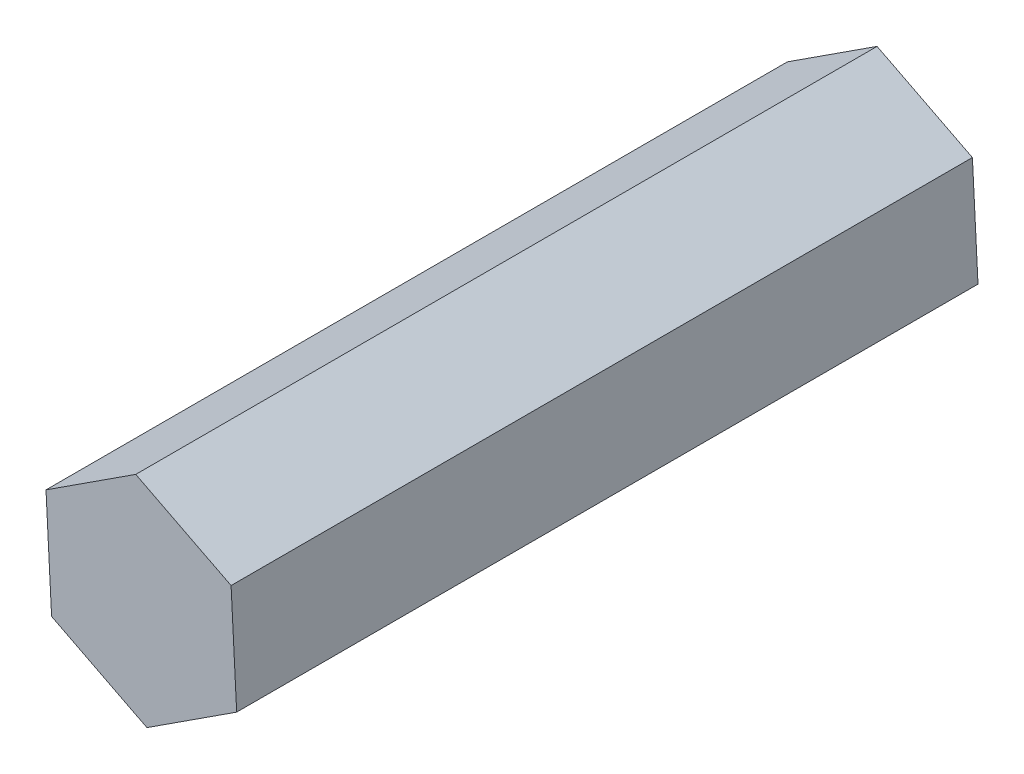
ISO-10303-21;
HEADER;
FILE_DESCRIPTION(('STEP AP214'),'2;1');
FILE_NAME('part.step','',(''),(''),'','','');
FILE_SCHEMA(('AUTOMOTIVE_DESIGN { 1 0 10303 214 1 1 1 1 }'));
ENDSEC;
DATA;
#1=APPLICATION_CONTEXT('core data for automotive mechanical design processes');
#2=APPLICATION_PROTOCOL_DEFINITION('international standard','automotive_design',2000,#1);
#3=PRODUCT_CONTEXT('',#1,'mechanical');
#4=PRODUCT('Part','Part','',(#3));
#5=PRODUCT_RELATED_PRODUCT_CATEGORY('part','',(#4));
#6=PRODUCT_DEFINITION_FORMATION('','',#4);
#7=PRODUCT_DEFINITION_CONTEXT('part definition',#1,'design');
#8=PRODUCT_DEFINITION('design','',#6,#7);
#9=PRODUCT_DEFINITION_SHAPE('','',#8);
#10=(LENGTH_UNIT() NAMED_UNIT(*) SI_UNIT(.MILLI.,.METRE.));
#11=(NAMED_UNIT(*) PLANE_ANGLE_UNIT() SI_UNIT($,.RADIAN.));
#12=(NAMED_UNIT(*) SI_UNIT($,.STERADIAN.) SOLID_ANGLE_UNIT());
#13=UNCERTAINTY_MEASURE_WITH_UNIT(LENGTH_MEASURE(1.E-05),#10,'distance_accuracy_value','');
#14=(GEOMETRIC_REPRESENTATION_CONTEXT(3) GLOBAL_UNCERTAINTY_ASSIGNED_CONTEXT((#13)) GLOBAL_UNIT_ASSIGNED_CONTEXT((#10,
#11,#12)) REPRESENTATION_CONTEXT('',''));
#15=CARTESIAN_POINT('',(0.,0.,0.));
#16=DIRECTION('',(0.,0.,1.));
#17=DIRECTION('',(1.,0.,0.));
#18=AXIS2_PLACEMENT_3D('',#15,#16,#17);
#19=CARTESIAN_POINT('',(-0.383222680415475,7.32232706935087,50.8));
#20=DIRECTION('',(0.544579155708624,-0.838709450982688,0.));
#21=DIRECTION('',(0.838709450982688,0.544579155708624,0.));
#22=AXIS2_PLACEMENT_3D('',#19,#20,#21);
#23=PLANE('',#22);
#24=DIRECTION('',(-0.838709450982688,-0.544579155708624,0.));
#25=VECTOR('',#24,1.);
#26=CARTESIAN_POINT('',(-0.383222680415475,7.32232706935087,0.));
#27=LINE('',#26,#25);
#28=CARTESIAN_POINT('',(-0.383222680415475,7.32232706935087,0.));
#29=VERTEX_POINT('',#28);
#30=CARTESIAN_POINT('',(-6.53293259708405,3.32928295812927,0.));
#31=VERTEX_POINT('',#30);
#32=EDGE_CURVE('E128',#29,#31,#27,.T.);
#33=ORIENTED_EDGE('',*,*,#32,.T.);
#34=DIRECTION('',(0.,0.,-1.));
#35=VECTOR('',#34,1.);
#36=CARTESIAN_POINT('',(-6.53293259708405,3.32928295812927,50.8));
#37=LINE('',#36,#35);
#38=CARTESIAN_POINT('',(-6.53293259708405,3.32928295812927,50.8));
#39=VERTEX_POINT('',#38);
#40=EDGE_CURVE('E11',#39,#31,#37,.T.);
#41=ORIENTED_EDGE('',*,*,#40,.F.);
#42=DIRECTION('',(-0.838709450982688,-0.544579155708624,0.));
#43=VECTOR('',#42,1.);
#44=CARTESIAN_POINT('',(-0.383222680415475,7.32232706935087,50.8));
#45=LINE('',#44,#43);
#46=CARTESIAN_POINT('',(-0.383222680415475,7.32232706935087,50.8));
#47=VERTEX_POINT('',#46);
#48=EDGE_CURVE('E144',#47,#39,#45,.T.);
#49=ORIENTED_EDGE('',*,*,#48,.F.);
#50=DIRECTION('',(0.,0.,-1.));
#51=VECTOR('',#50,1.);
#52=CARTESIAN_POINT('',(-0.383222680415475,7.32232706935087,50.8));
#53=LINE('',#52,#51);
#54=EDGE_CURVE('E124',#47,#29,#53,.T.);
#55=ORIENTED_EDGE('',*,*,#54,.T.);
#56=EDGE_LOOP('',(#33,#41,#49,#55));
#57=FACE_BOUND('',#56,.T.);
#58=ADVANCED_FACE('F39',(#57),#23,.F.);
#59=CARTESIAN_POINT('',(-6.53293259708405,3.32928295812927,50.8));
#60=DIRECTION('',(0.998633268799419,0.0522646577238061,0.));
#61=DIRECTION('',(-0.0522646577238061,0.998633268799419,0.));
#62=AXIS2_PLACEMENT_3D('',#59,#60,#61);
#63=PLANE('',#62);
#64=DIRECTION('',(0.0522646577238061,-0.998633268799419,0.));
#65=VECTOR('',#64,1.);
#66=CARTESIAN_POINT('',(-6.53293259708405,3.32928295812927,0.));
#67=LINE('',#66,#65);
#68=CARTESIAN_POINT('',(-6.14970991666858,-3.9930441112216,0.));
#69=VERTEX_POINT('',#68);
#70=EDGE_CURVE('E132',#31,#69,#67,.T.);
#71=ORIENTED_EDGE('',*,*,#70,.T.);
#72=DIRECTION('',(0.,0.,-1.));
#73=VECTOR('',#72,1.);
#74=CARTESIAN_POINT('',(-6.14970991666858,-3.9930441112216,50.8));
#75=LINE('',#74,#73);
#76=CARTESIAN_POINT('',(-6.14970991666858,-3.9930441112216,50.8));
#77=VERTEX_POINT('',#76);
#78=EDGE_CURVE('E48',#77,#69,#75,.T.);
#79=ORIENTED_EDGE('',*,*,#78,.F.);
#80=DIRECTION('',(0.0522646577238061,-0.998633268799419,0.));
#81=VECTOR('',#80,1.);
#82=CARTESIAN_POINT('',(-6.53293259708405,3.32928295812927,50.8));
#83=LINE('',#82,#81);
#84=EDGE_CURVE('E93',#39,#77,#83,.T.);
#85=ORIENTED_EDGE('',*,*,#84,.F.);
#86=ORIENTED_EDGE('',*,*,#40,.T.);
#87=EDGE_LOOP('',(#71,#79,#85,#86));
#88=FACE_BOUND('',#87,.T.);
#89=ADVANCED_FACE('F172',(#88),#63,.F.);
#90=CARTESIAN_POINT('',(-6.14970991666858,-3.9930441112216,50.8));
#91=DIRECTION('',(0.454054113090795,0.890974108706494,0.));
#92=DIRECTION('',(-0.890974108706494,0.454054113090795,0.));
#93=AXIS2_PLACEMENT_3D('',#90,#91,#92);
#94=PLANE('',#93);
#95=DIRECTION('',(0.890974108706494,-0.454054113090795,0.));
#96=VECTOR('',#95,1.);
#97=CARTESIAN_POINT('',(-6.14970991666858,-3.9930441112216,0.));
#98=LINE('',#97,#96);
#99=CARTESIAN_POINT('',(0.383222680415474,-7.32232706935087,0.));
#100=VERTEX_POINT('',#99);
#101=EDGE_CURVE('E135',#69,#100,#98,.T.);
#102=ORIENTED_EDGE('',*,*,#101,.T.);
#103=DIRECTION('',(0.,0.,-1.));
#104=VECTOR('',#103,1.);
#105=CARTESIAN_POINT('',(0.383222680415474,-7.32232706935087,50.8));
#106=LINE('',#105,#104);
#107=CARTESIAN_POINT('',(0.383222680415474,-7.32232706935087,50.8));
#108=VERTEX_POINT('',#107);
#109=EDGE_CURVE('E117',#108,#100,#106,.T.);
#110=ORIENTED_EDGE('',*,*,#109,.F.);
#111=DIRECTION('',(0.890974108706494,-0.454054113090795,0.));
#112=VECTOR('',#111,1.);
#113=CARTESIAN_POINT('',(-6.14970991666858,-3.9930441112216,50.8));
#114=LINE('',#113,#112);
#115=EDGE_CURVE('E106',#77,#108,#114,.T.);
#116=ORIENTED_EDGE('',*,*,#115,.F.);
#117=ORIENTED_EDGE('',*,*,#78,.T.);
#118=EDGE_LOOP('',(#102,#110,#116,#117));
#119=FACE_BOUND('',#118,.T.);
#120=ADVANCED_FACE('F154',(#119),#94,.F.);
#121=CARTESIAN_POINT('',(0.383222680415474,-7.32232706935087,50.8));
#122=DIRECTION('',(-0.544579155708624,0.838709450982688,0.));
#123=DIRECTION('',(-0.838709450982688,-0.544579155708624,0.));
#124=AXIS2_PLACEMENT_3D('',#121,#122,#123);
#125=PLANE('',#124);
#126=DIRECTION('',(0.838709450982688,0.544579155708624,0.));
#127=VECTOR('',#126,1.);
#128=CARTESIAN_POINT('',(0.383222680415474,-7.32232706935087,0.));
#129=LINE('',#128,#127);
#130=CARTESIAN_POINT('',(6.53293259708405,-3.32928295812927,0.));
#131=VERTEX_POINT('',#130);
#132=EDGE_CURVE('E115',#100,#131,#129,.T.);
#133=ORIENTED_EDGE('',*,*,#132,.T.);
#134=DIRECTION('',(0.,0.,-1.));
#135=VECTOR('',#134,1.);
#136=CARTESIAN_POINT('',(6.53293259708405,-3.32928295812927,50.8));
#137=LINE('',#136,#135);
#138=CARTESIAN_POINT('',(6.53293259708405,-3.32928295812927,50.8));
#139=VERTEX_POINT('',#138);
#140=EDGE_CURVE('E112',#139,#131,#137,.T.);
#141=ORIENTED_EDGE('',*,*,#140,.F.);
#142=DIRECTION('',(0.838709450982688,0.544579155708624,0.));
#143=VECTOR('',#142,1.);
#144=CARTESIAN_POINT('',(0.383222680415474,-7.32232706935087,50.8));
#145=LINE('',#144,#143);
#146=EDGE_CURVE('E100',#108,#139,#145,.T.);
#147=ORIENTED_EDGE('',*,*,#146,.F.);
#148=ORIENTED_EDGE('',*,*,#109,.T.);
#149=EDGE_LOOP('',(#133,#141,#147,#148));
#150=FACE_BOUND('',#149,.T.);
#151=ADVANCED_FACE('F113',(#150),#125,.F.);
#152=CARTESIAN_POINT('',(6.53293259708405,-3.32928295812927,50.8));
#153=DIRECTION('',(-0.998633268799419,-0.0522646577238062,0.));
#154=DIRECTION('',(0.0522646577238062,-0.998633268799419,0.));
#155=AXIS2_PLACEMENT_3D('',#152,#153,#154);
#156=PLANE('',#155);
#157=DIRECTION('',(-0.0522646577238062,0.998633268799419,0.));
#158=VECTOR('',#157,1.);
#159=CARTESIAN_POINT('',(6.53293259708405,-3.32928295812927,0.));
#160=LINE('',#159,#158);
#161=CARTESIAN_POINT('',(6.14970991666857,3.99304411122161,0.));
#162=VERTEX_POINT('',#161);
#163=EDGE_CURVE('E79',#131,#162,#160,.T.);
#164=ORIENTED_EDGE('',*,*,#163,.T.);
#165=DIRECTION('',(0.,0.,-1.));
#166=VECTOR('',#165,1.);
#167=CARTESIAN_POINT('',(6.14970991666857,3.99304411122161,50.8));
#168=LINE('',#167,#166);
#169=CARTESIAN_POINT('',(6.14970991666857,3.99304411122161,50.8));
#170=VERTEX_POINT('',#169);
#171=EDGE_CURVE('E118',#170,#162,#168,.T.);
#172=ORIENTED_EDGE('',*,*,#171,.F.);
#173=DIRECTION('',(-0.0522646577238062,0.998633268799419,0.));
#174=VECTOR('',#173,1.);
#175=CARTESIAN_POINT('',(6.53293259708405,-3.32928295812927,50.8));
#176=LINE('',#175,#174);
#177=EDGE_CURVE('E104',#139,#170,#176,.T.);
#178=ORIENTED_EDGE('',*,*,#177,.F.);
#179=ORIENTED_EDGE('',*,*,#140,.T.);
#180=EDGE_LOOP('',(#164,#172,#178,#179));
#181=FACE_BOUND('',#180,.T.);
#182=ADVANCED_FACE('F120',(#181),#156,.F.);
#183=CARTESIAN_POINT('',(6.14970991666857,3.99304411122161,50.8));
#184=DIRECTION('',(-0.454054113090795,-0.890974108706494,0.));
#185=DIRECTION('',(0.890974108706494,-0.454054113090795,0.));
#186=AXIS2_PLACEMENT_3D('',#183,#184,#185);
#187=PLANE('',#186);
#188=DIRECTION('',(-0.890974108706494,0.454054113090795,0.));
#189=VECTOR('',#188,1.);
#190=CARTESIAN_POINT('',(6.14970991666857,3.99304411122161,0.));
#191=LINE('',#190,#189);
#192=EDGE_CURVE('E85',#162,#29,#191,.T.);
#193=ORIENTED_EDGE('',*,*,#192,.T.);
#194=ORIENTED_EDGE('',*,*,#54,.F.);
#195=DIRECTION('',(-0.890974108706494,0.454054113090795,0.));
#196=VECTOR('',#195,1.);
#197=CARTESIAN_POINT('',(6.14970991666857,3.99304411122161,50.8));
#198=LINE('',#197,#196);
#199=EDGE_CURVE('E56',#170,#47,#198,.T.);
#200=ORIENTED_EDGE('',*,*,#199,.F.);
#201=ORIENTED_EDGE('',*,*,#171,.T.);
#202=EDGE_LOOP('',(#193,#194,#200,#201));
#203=FACE_BOUND('',#202,.T.);
#204=ADVANCED_FACE('F161',(#203),#187,.F.);
#205=CARTESIAN_POINT('',(0.,0.,50.8));
#206=DIRECTION('',(0.,0.,1.));
#207=DIRECTION('',(1.,0.,0.));
#208=AXIS2_PLACEMENT_3D('',#205,#206,#207);
#209=PLANE('',#208);
#210=ORIENTED_EDGE('',*,*,#48,.T.);
#211=ORIENTED_EDGE('',*,*,#84,.T.);
#212=ORIENTED_EDGE('',*,*,#115,.T.);
#213=ORIENTED_EDGE('',*,*,#146,.T.);
#214=ORIENTED_EDGE('',*,*,#177,.T.);
#215=ORIENTED_EDGE('',*,*,#199,.T.);
#216=EDGE_LOOP('',(#210,#211,#212,#213,#214,#215));
#217=FACE_BOUND('',#216,.T.);
#218=ADVANCED_FACE('F102',(#217),#209,.T.);
#219=CARTESIAN_POINT('',(0.,0.,0.));
#220=DIRECTION('',(0.,0.,1.));
#221=DIRECTION('',(1.,0.,0.));
#222=AXIS2_PLACEMENT_3D('',#219,#220,#221);
#223=PLANE('',#222);
#224=ORIENTED_EDGE('',*,*,#32,.F.);
#225=ORIENTED_EDGE('',*,*,#192,.F.);
#226=ORIENTED_EDGE('',*,*,#163,.F.);
#227=ORIENTED_EDGE('',*,*,#132,.F.);
#228=ORIENTED_EDGE('',*,*,#101,.F.);
#229=ORIENTED_EDGE('',*,*,#70,.F.);
#230=EDGE_LOOP('',(#224,#225,#226,#227,#228,#229));
#231=FACE_BOUND('',#230,.T.);
#232=ADVANCED_FACE('F157',(#231),#223,.F.);
#233=CLOSED_SHELL('',(#58,#89,#120,#151,#182,#204,#218,#232));
#234=MANIFOLD_SOLID_BREP('B2',#233);
#235=ADVANCED_BREP_SHAPE_REPRESENTATION('',(#18,#234),#14);
#236=SHAPE_DEFINITION_REPRESENTATION(#9,#235);
ENDSEC;
END-ISO-10303-21;
